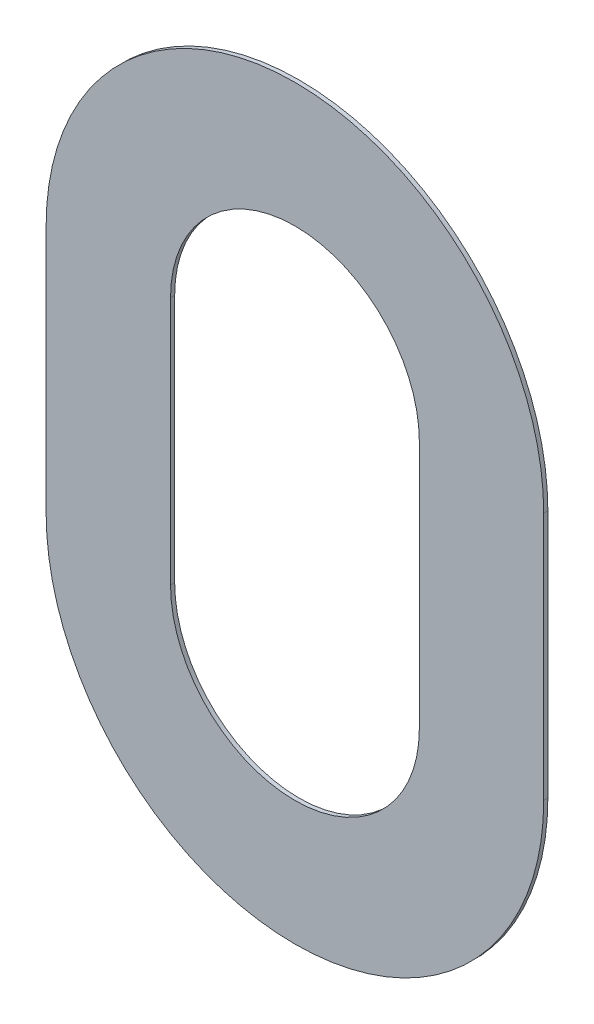
ISO-10303-21;
HEADER;
FILE_DESCRIPTION(('STEP AP214'),'2;1');
FILE_NAME('part.step','',(''),(''),'','','');
FILE_SCHEMA(('AUTOMOTIVE_DESIGN { 1 0 10303 214 1 1 1 1 }'));
ENDSEC;
DATA;
#1=APPLICATION_CONTEXT('core data for automotive mechanical design processes');
#2=APPLICATION_PROTOCOL_DEFINITION('international standard','automotive_design',2000,#1);
#3=PRODUCT_CONTEXT('',#1,'mechanical');
#4=PRODUCT('Part','Part','',(#3));
#5=PRODUCT_RELATED_PRODUCT_CATEGORY('part','',(#4));
#6=PRODUCT_DEFINITION_FORMATION('','',#4);
#7=PRODUCT_DEFINITION_CONTEXT('part definition',#1,'design');
#8=PRODUCT_DEFINITION('design','',#6,#7);
#9=PRODUCT_DEFINITION_SHAPE('','',#8);
#10=(LENGTH_UNIT() NAMED_UNIT(*) SI_UNIT(.MILLI.,.METRE.));
#11=(NAMED_UNIT(*) PLANE_ANGLE_UNIT() SI_UNIT($,.RADIAN.));
#12=(NAMED_UNIT(*) SI_UNIT($,.STERADIAN.) SOLID_ANGLE_UNIT());
#13=UNCERTAINTY_MEASURE_WITH_UNIT(LENGTH_MEASURE(1.E-05),#10,'distance_accuracy_value','');
#14=(GEOMETRIC_REPRESENTATION_CONTEXT(3) GLOBAL_UNCERTAINTY_ASSIGNED_CONTEXT((#13)) GLOBAL_UNIT_ASSIGNED_CONTEXT((#10,
#11,#12)) REPRESENTATION_CONTEXT('',''));
#15=CARTESIAN_POINT('',(0.,0.,0.));
#16=DIRECTION('',(0.,0.,1.));
#17=DIRECTION('',(1.,0.,0.));
#18=AXIS2_PLACEMENT_3D('',#15,#16,#17);
#19=CARTESIAN_POINT('',(2.7499960066,3.055,0.0762));
#20=DIRECTION('',(0.,0.,1.));
#21=DIRECTION('',(1.,0.,0.));
#22=AXIS2_PLACEMENT_3D('',#19,#20,#21);
#23=PLANE('',#22);
#24=DIRECTION('',(0.,1.,0.));
#25=VECTOR('',#24,1.);
#26=CARTESIAN_POINT('',(4.62,3.3,0.0762));
#27=LINE('',#26,#25);
#28=CARTESIAN_POINT('',(4.62,3.3,0.0762));
#29=VERTEX_POINT('',#28);
#30=CARTESIAN_POINT('',(4.62,2.7,0.0762));
#31=VERTEX_POINT('',#30);
#32=EDGE_CURVE('E113',#29,#31,#27,.F.);
#33=ORIENTED_EDGE('',*,*,#32,.F.);
#34=CARTESIAN_POINT('',(4.32,3.3,0.0762));
#35=DIRECTION('',(0.,0.,1.));
#36=DIRECTION('',(1.,0.,0.));
#37=AXIS2_PLACEMENT_3D('',#34,#35,#36);
#38=CIRCLE('',#37,0.3);
#39=CARTESIAN_POINT('',(4.02,3.3,0.0762));
#40=VERTEX_POINT('',#39);
#41=EDGE_CURVE('E132',#29,#40,#38,.T.);
#42=ORIENTED_EDGE('',*,*,#41,.T.);
#43=DIRECTION('',(0.,1.,0.));
#44=VECTOR('',#43,1.);
#45=CARTESIAN_POINT('',(4.02,2.7,0.0762));
#46=LINE('',#45,#44);
#47=CARTESIAN_POINT('',(4.02,2.7,0.0762));
#48=VERTEX_POINT('',#47);
#49=EDGE_CURVE('E109',#48,#40,#46,.T.);
#50=ORIENTED_EDGE('',*,*,#49,.F.);
#51=CARTESIAN_POINT('',(4.32,2.7,0.0762));
#52=DIRECTION('',(0.,0.,1.));
#53=DIRECTION('',(1.,0.,0.));
#54=AXIS2_PLACEMENT_3D('',#51,#52,#53);
#55=CIRCLE('',#54,0.3);
#56=EDGE_CURVE('E115',#48,#31,#55,.T.);
#57=ORIENTED_EDGE('',*,*,#56,.T.);
#58=EDGE_LOOP('',(#33,#42,#50,#57));
#59=FACE_BOUND('',#58,.T.);
#60=CARTESIAN_POINT('',(4.32,3.3,0.0762));
#61=DIRECTION('',(0.,0.,1.));
#62=DIRECTION('',(1.,0.,0.));
#63=AXIS2_PLACEMENT_3D('',#60,#61,#62);
#64=CIRCLE('',#63,0.6);
#65=CARTESIAN_POINT('',(4.92,3.3,0.0762));
#66=VERTEX_POINT('',#65);
#67=CARTESIAN_POINT('',(3.72,3.3,0.0762));
#68=VERTEX_POINT('',#67);
#69=EDGE_CURVE('E20',#66,#68,#64,.T.);
#70=ORIENTED_EDGE('',*,*,#69,.F.);
#71=DIRECTION('',(0.,1.,0.));
#72=VECTOR('',#71,1.);
#73=CARTESIAN_POINT('',(4.92,2.7,0.0762));
#74=LINE('',#73,#72);
#75=CARTESIAN_POINT('',(4.92,2.7,0.0762));
#76=VERTEX_POINT('',#75);
#77=EDGE_CURVE('E78',#76,#66,#74,.T.);
#78=ORIENTED_EDGE('',*,*,#77,.F.);
#79=CARTESIAN_POINT('',(4.32,2.7,0.0762));
#80=DIRECTION('',(0.,0.,1.));
#81=DIRECTION('',(1.,0.,0.));
#82=AXIS2_PLACEMENT_3D('',#79,#80,#81);
#83=CIRCLE('',#82,0.6);
#84=CARTESIAN_POINT('',(3.72,2.7,0.0762));
#85=VERTEX_POINT('',#84);
#86=EDGE_CURVE('E94',#85,#76,#83,.T.);
#87=ORIENTED_EDGE('',*,*,#86,.F.);
#88=DIRECTION('',(0.,1.,0.));
#89=VECTOR('',#88,1.);
#90=CARTESIAN_POINT('',(3.72,3.3,0.0762));
#91=LINE('',#90,#89);
#92=EDGE_CURVE('E92',#68,#85,#91,.F.);
#93=ORIENTED_EDGE('',*,*,#92,.F.);
#94=EDGE_LOOP('',(#70,#78,#87,#93));
#95=FACE_BOUND('',#94,.T.);
#96=ADVANCED_FACE('F17',(#59,#95),#23,.F.);
#97=CARTESIAN_POINT('',(4.92,2.7,0.0762));
#98=DIRECTION('',(1.,0.,0.));
#99=DIRECTION('',(0.,0.,-1.));
#100=AXIS2_PLACEMENT_3D('',#97,#98,#99);
#101=PLANE('',#100);
#102=DIRECTION('',(0.,0.,1.));
#103=VECTOR('',#102,1.);
#104=CARTESIAN_POINT('',(4.92,2.7,0.0762));
#105=LINE('',#104,#103);
#106=CARTESIAN_POINT('',(4.92,2.7,0.0862));
#107=VERTEX_POINT('',#106);
#108=EDGE_CURVE('E97',#76,#107,#105,.T.);
#109=ORIENTED_EDGE('',*,*,#108,.F.);
#110=ORIENTED_EDGE('',*,*,#77,.T.);
#111=DIRECTION('',(0.,0.,1.));
#112=VECTOR('',#111,1.);
#113=CARTESIAN_POINT('',(4.92,3.3,0.0762));
#114=LINE('',#113,#112);
#115=CARTESIAN_POINT('',(4.92,3.3,0.0862));
#116=VERTEX_POINT('',#115);
#117=EDGE_CURVE('E89',#116,#66,#114,.F.);
#118=ORIENTED_EDGE('',*,*,#117,.F.);
#119=DIRECTION('',(0.,1.,0.));
#120=VECTOR('',#119,1.);
#121=CARTESIAN_POINT('',(4.92,0.,0.0862));
#122=LINE('',#121,#120);
#123=EDGE_CURVE('E112',#107,#116,#122,.T.);
#124=ORIENTED_EDGE('',*,*,#123,.F.);
#125=EDGE_LOOP('',(#109,#110,#118,#124));
#126=FACE_BOUND('',#125,.T.);
#127=ADVANCED_FACE('F228',(#126),#101,.T.);
#128=CARTESIAN_POINT('',(4.32,3.3,0.0762));
#129=DIRECTION('',(0.,0.,1.));
#130=DIRECTION('',(1.,0.,0.));
#131=AXIS2_PLACEMENT_3D('',#128,#129,#130);
#132=CYLINDRICAL_SURFACE('',#131,0.6);
#133=ORIENTED_EDGE('',*,*,#117,.T.);
#134=ORIENTED_EDGE('',*,*,#69,.T.);
#135=DIRECTION('',(0.,0.,1.));
#136=VECTOR('',#135,1.);
#137=CARTESIAN_POINT('',(3.72,3.3,0.0762));
#138=LINE('',#137,#136);
#139=CARTESIAN_POINT('',(3.72,3.3,0.0862));
#140=VERTEX_POINT('',#139);
#141=EDGE_CURVE('E87',#140,#68,#138,.F.);
#142=ORIENTED_EDGE('',*,*,#141,.F.);
#143=CARTESIAN_POINT('',(4.32,3.3,0.0862));
#144=DIRECTION('',(0.,0.,1.));
#145=DIRECTION('',(1.,0.,0.));
#146=AXIS2_PLACEMENT_3D('',#143,#144,#145);
#147=CIRCLE('',#146,0.6);
#148=EDGE_CURVE('E128',#116,#140,#147,.T.);
#149=ORIENTED_EDGE('',*,*,#148,.F.);
#150=EDGE_LOOP('',(#133,#134,#142,#149));
#151=FACE_BOUND('',#150,.T.);
#152=ADVANCED_FACE('F84',(#151),#132,.T.);
#153=CARTESIAN_POINT('',(3.72,3.3,0.0762));
#154=DIRECTION('',(-1.,0.,0.));
#155=DIRECTION('',(0.,0.,1.));
#156=AXIS2_PLACEMENT_3D('',#153,#154,#155);
#157=PLANE('',#156);
#158=ORIENTED_EDGE('',*,*,#141,.T.);
#159=ORIENTED_EDGE('',*,*,#92,.T.);
#160=DIRECTION('',(0.,0.,1.));
#161=VECTOR('',#160,1.);
#162=CARTESIAN_POINT('',(3.72,2.7,0.0762));
#163=LINE('',#162,#161);
#164=CARTESIAN_POINT('',(3.72,2.7,0.0862));
#165=VERTEX_POINT('',#164);
#166=EDGE_CURVE('E106',#165,#85,#163,.F.);
#167=ORIENTED_EDGE('',*,*,#166,.F.);
#168=DIRECTION('',(0.,1.,0.));
#169=VECTOR('',#168,1.);
#170=CARTESIAN_POINT('',(3.72,0.,0.0862));
#171=LINE('',#170,#169);
#172=EDGE_CURVE('E101',#140,#165,#171,.F.);
#173=ORIENTED_EDGE('',*,*,#172,.F.);
#174=EDGE_LOOP('',(#158,#159,#167,#173));
#175=FACE_BOUND('',#174,.T.);
#176=ADVANCED_FACE('F99',(#175),#157,.T.);
#177=CARTESIAN_POINT('',(4.32,2.7,0.0762));
#178=DIRECTION('',(0.,0.,1.));
#179=DIRECTION('',(1.,0.,0.));
#180=AXIS2_PLACEMENT_3D('',#177,#178,#179);
#181=CYLINDRICAL_SURFACE('',#180,0.6);
#182=ORIENTED_EDGE('',*,*,#166,.T.);
#183=ORIENTED_EDGE('',*,*,#86,.T.);
#184=ORIENTED_EDGE('',*,*,#108,.T.);
#185=CARTESIAN_POINT('',(4.32,2.7,0.0862));
#186=DIRECTION('',(0.,0.,1.));
#187=DIRECTION('',(1.,0.,0.));
#188=AXIS2_PLACEMENT_3D('',#185,#186,#187);
#189=CIRCLE('',#188,0.6);
#190=EDGE_CURVE('E125',#165,#107,#189,.T.);
#191=ORIENTED_EDGE('',*,*,#190,.F.);
#192=EDGE_LOOP('',(#182,#183,#184,#191));
#193=FACE_BOUND('',#192,.T.);
#194=ADVANCED_FACE('F202',(#193),#181,.T.);
#195=CARTESIAN_POINT('',(4.32,3.3,0.0762));
#196=DIRECTION('',(0.,0.,1.));
#197=DIRECTION('',(1.,0.,0.));
#198=AXIS2_PLACEMENT_3D('',#195,#196,#197);
#199=CYLINDRICAL_SURFACE('',#198,0.3);
#200=CARTESIAN_POINT('',(4.32,3.3,0.0862));
#201=DIRECTION('',(0.,0.,1.));
#202=DIRECTION('',(1.,0.,0.));
#203=AXIS2_PLACEMENT_3D('',#200,#201,#202);
#204=CIRCLE('',#203,0.3);
#205=CARTESIAN_POINT('',(4.02,3.3,0.0862));
#206=VERTEX_POINT('',#205);
#207=CARTESIAN_POINT('',(4.62,3.3,0.0862));
#208=VERTEX_POINT('',#207);
#209=EDGE_CURVE('E122',#206,#208,#204,.F.);
#210=ORIENTED_EDGE('',*,*,#209,.F.);
#211=DIRECTION('',(0.,0.,-1.));
#212=VECTOR('',#211,1.);
#213=CARTESIAN_POINT('',(4.02,3.3,0.0762));
#214=LINE('',#213,#212);
#215=EDGE_CURVE('E140',#40,#206,#214,.F.);
#216=ORIENTED_EDGE('',*,*,#215,.F.);
#217=ORIENTED_EDGE('',*,*,#41,.F.);
#218=DIRECTION('',(0.,0.,1.));
#219=VECTOR('',#218,1.);
#220=CARTESIAN_POINT('',(4.62,3.3,0.0762));
#221=LINE('',#220,#219);
#222=EDGE_CURVE('E116',#208,#29,#221,.F.);
#223=ORIENTED_EDGE('',*,*,#222,.F.);
#224=EDGE_LOOP('',(#210,#216,#217,#223));
#225=FACE_BOUND('',#224,.T.);
#226=ADVANCED_FACE('F167',(#225),#199,.F.);
#227=CARTESIAN_POINT('',(4.62,3.3,0.0762));
#228=DIRECTION('',(-1.,0.,0.));
#229=DIRECTION('',(0.,0.,1.));
#230=AXIS2_PLACEMENT_3D('',#227,#228,#229);
#231=PLANE('',#230);
#232=ORIENTED_EDGE('',*,*,#222,.T.);
#233=ORIENTED_EDGE('',*,*,#32,.T.);
#234=DIRECTION('',(0.,0.,1.));
#235=VECTOR('',#234,1.);
#236=CARTESIAN_POINT('',(4.62,2.7,0.0762));
#237=LINE('',#236,#235);
#238=CARTESIAN_POINT('',(4.62,2.7,0.0862));
#239=VERTEX_POINT('',#238);
#240=EDGE_CURVE('E131',#31,#239,#237,.T.);
#241=ORIENTED_EDGE('',*,*,#240,.T.);
#242=DIRECTION('',(0.,1.,0.));
#243=VECTOR('',#242,1.);
#244=CARTESIAN_POINT('',(4.62,0.,0.0862));
#245=LINE('',#244,#243);
#246=EDGE_CURVE('E121',#208,#239,#245,.F.);
#247=ORIENTED_EDGE('',*,*,#246,.F.);
#248=EDGE_LOOP('',(#232,#233,#241,#247));
#249=FACE_BOUND('',#248,.T.);
#250=ADVANCED_FACE('F153',(#249),#231,.T.);
#251=CARTESIAN_POINT('',(4.32,2.7,0.0762));
#252=DIRECTION('',(0.,0.,1.));
#253=DIRECTION('',(1.,0.,0.));
#254=AXIS2_PLACEMENT_3D('',#251,#252,#253);
#255=CYLINDRICAL_SURFACE('',#254,0.3);
#256=CARTESIAN_POINT('',(4.32,2.7,0.0862));
#257=DIRECTION('',(0.,0.,1.));
#258=DIRECTION('',(1.,0.,0.));
#259=AXIS2_PLACEMENT_3D('',#256,#257,#258);
#260=CIRCLE('',#259,0.3);
#261=CARTESIAN_POINT('',(4.02,2.7,0.0862));
#262=VERTEX_POINT('',#261);
#263=EDGE_CURVE('E26',#239,#262,#260,.F.);
#264=ORIENTED_EDGE('',*,*,#263,.F.);
#265=ORIENTED_EDGE('',*,*,#240,.F.);
#266=ORIENTED_EDGE('',*,*,#56,.F.);
#267=DIRECTION('',(0.,0.,-1.));
#268=VECTOR('',#267,1.);
#269=CARTESIAN_POINT('',(4.02,2.7,0.0762));
#270=LINE('',#269,#268);
#271=EDGE_CURVE('E35',#262,#48,#270,.T.);
#272=ORIENTED_EDGE('',*,*,#271,.F.);
#273=EDGE_LOOP('',(#264,#265,#266,#272));
#274=FACE_BOUND('',#273,.T.);
#275=ADVANCED_FACE('F156',(#274),#255,.F.);
#276=CARTESIAN_POINT('',(4.02,2.7,0.0762));
#277=DIRECTION('',(1.,0.,0.));
#278=DIRECTION('',(0.,0.,-1.));
#279=AXIS2_PLACEMENT_3D('',#276,#277,#278);
#280=PLANE('',#279);
#281=ORIENTED_EDGE('',*,*,#271,.T.);
#282=ORIENTED_EDGE('',*,*,#49,.T.);
#283=ORIENTED_EDGE('',*,*,#215,.T.);
#284=DIRECTION('',(0.,1.,0.));
#285=VECTOR('',#284,1.);
#286=CARTESIAN_POINT('',(4.02,0.,0.0862));
#287=LINE('',#286,#285);
#288=EDGE_CURVE('E11',#262,#206,#287,.T.);
#289=ORIENTED_EDGE('',*,*,#288,.F.);
#290=EDGE_LOOP('',(#281,#282,#283,#289));
#291=FACE_BOUND('',#290,.T.);
#292=ADVANCED_FACE('F158',(#291),#280,.T.);
#293=CARTESIAN_POINT('',(0.,0.,0.0862));
#294=DIRECTION('',(0.,0.,1.));
#295=DIRECTION('',(1.,0.,0.));
#296=AXIS2_PLACEMENT_3D('',#293,#294,#295);
#297=PLANE('',#296);
#298=ORIENTED_EDGE('',*,*,#263,.T.);
#299=ORIENTED_EDGE('',*,*,#288,.T.);
#300=ORIENTED_EDGE('',*,*,#209,.T.);
#301=ORIENTED_EDGE('',*,*,#246,.T.);
#302=EDGE_LOOP('',(#298,#299,#300,#301));
#303=FACE_BOUND('',#302,.T.);
#304=ORIENTED_EDGE('',*,*,#172,.T.);
#305=ORIENTED_EDGE('',*,*,#190,.T.);
#306=ORIENTED_EDGE('',*,*,#123,.T.);
#307=ORIENTED_EDGE('',*,*,#148,.T.);
#308=EDGE_LOOP('',(#304,#305,#306,#307));
#309=FACE_BOUND('',#308,.T.);
#310=ADVANCED_FACE('F150',(#303,#309),#297,.T.);
#311=CLOSED_SHELL('',(#96,#127,#152,#176,#194,#226,#250,#275,#292,#310));
#312=MANIFOLD_SOLID_BREP('B1',#311);
#313=ADVANCED_BREP_SHAPE_REPRESENTATION('',(#18,#312),#14);
#314=SHAPE_DEFINITION_REPRESENTATION(#9,#313);
ENDSEC;
END-ISO-10303-21;
